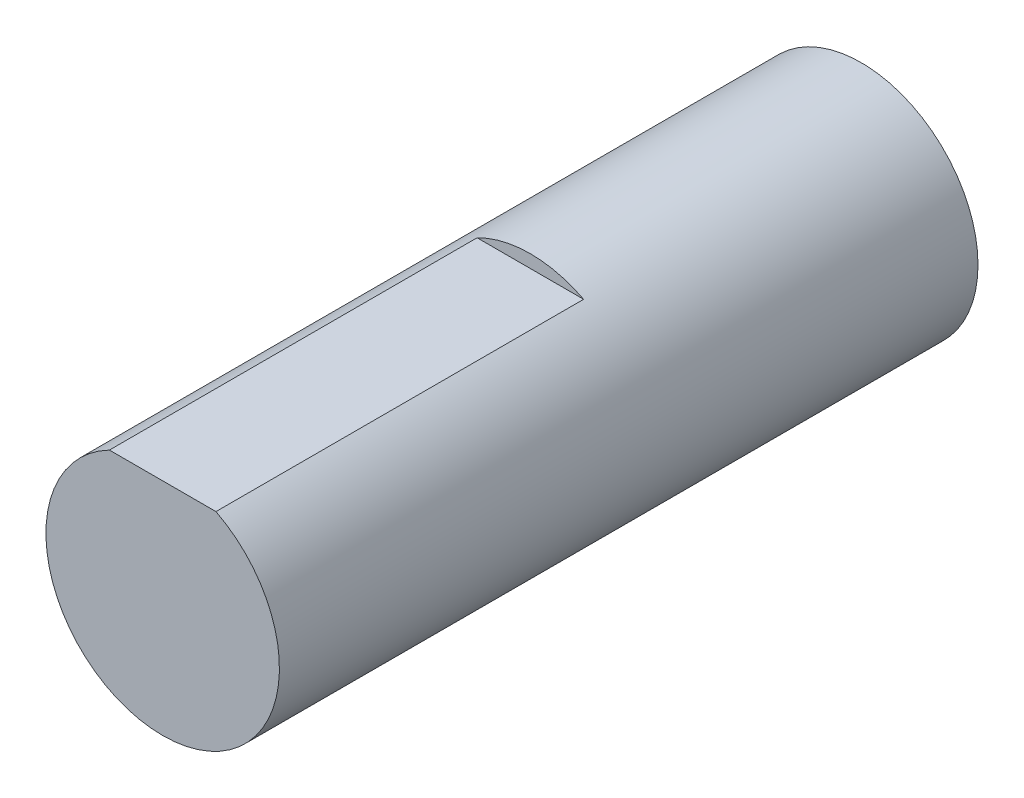
ISO-10303-21;
HEADER;
FILE_DESCRIPTION(('STEP AP214'),'2;1');
FILE_NAME('part.step','',(''),(''),'','','');
FILE_SCHEMA(('AUTOMOTIVE_DESIGN { 1 0 10303 214 1 1 1 1 }'));
ENDSEC;
DATA;
#1=APPLICATION_CONTEXT('core data for automotive mechanical design processes');
#2=APPLICATION_PROTOCOL_DEFINITION('international standard','automotive_design',2000,#1);
#3=PRODUCT_CONTEXT('',#1,'mechanical');
#4=PRODUCT('Part','Part','',(#3));
#5=PRODUCT_RELATED_PRODUCT_CATEGORY('part','',(#4));
#6=PRODUCT_DEFINITION_FORMATION('','',#4);
#7=PRODUCT_DEFINITION_CONTEXT('part definition',#1,'design');
#8=PRODUCT_DEFINITION('design','',#6,#7);
#9=PRODUCT_DEFINITION_SHAPE('','',#8);
#10=(LENGTH_UNIT() NAMED_UNIT(*) SI_UNIT(.MILLI.,.METRE.));
#11=(NAMED_UNIT(*) PLANE_ANGLE_UNIT() SI_UNIT($,.RADIAN.));
#12=(NAMED_UNIT(*) SI_UNIT($,.STERADIAN.) SOLID_ANGLE_UNIT());
#13=UNCERTAINTY_MEASURE_WITH_UNIT(LENGTH_MEASURE(1.E-05),#10,'distance_accuracy_value','');
#14=(GEOMETRIC_REPRESENTATION_CONTEXT(3) GLOBAL_UNCERTAINTY_ASSIGNED_CONTEXT((#13)) GLOBAL_UNIT_ASSIGNED_CONTEXT((#10,
#11,#12)) REPRESENTATION_CONTEXT('',''));
#15=CARTESIAN_POINT('',(0.,0.,0.));
#16=DIRECTION('',(0.,0.,1.));
#17=DIRECTION('',(1.,0.,0.));
#18=AXIS2_PLACEMENT_3D('',#15,#16,#17);
#19=CARTESIAN_POINT('',(0.,0.,19.));
#20=DIRECTION('',(0.,0.,-1.));
#21=DIRECTION('',(-1.,0.,0.));
#22=AXIS2_PLACEMENT_3D('',#19,#20,#21);
#23=CYLINDRICAL_SURFACE('',#22,3.175);
#24=CARTESIAN_POINT('',(0.,0.,9.));
#25=DIRECTION('',(0.,0.,-1.));
#26=DIRECTION('',(-1.,0.,0.));
#27=AXIS2_PLACEMENT_3D('',#24,#25,#26);
#28=CIRCLE('',#27,3.175);
#29=CARTESIAN_POINT('',(-1.44913767461894,2.825,9.));
#30=VERTEX_POINT('',#29);
#31=CARTESIAN_POINT('',(1.44913767461894,2.825,9.));
#32=VERTEX_POINT('',#31);
#33=EDGE_CURVE('E11',#30,#32,#28,.T.);
#34=ORIENTED_EDGE('',*,*,#33,.T.);
#35=DIRECTION('',(0.,0.,1.));
#36=VECTOR('',#35,1.);
#37=CARTESIAN_POINT('',(1.44913767461894,2.825,9.));
#38=LINE('',#37,#36);
#39=CARTESIAN_POINT('',(1.44913767461894,2.825,19.));
#40=VERTEX_POINT('',#39);
#41=EDGE_CURVE('E52',#32,#40,#38,.T.);
#42=ORIENTED_EDGE('',*,*,#41,.T.);
#43=CARTESIAN_POINT('',(0.,0.,19.));
#44=DIRECTION('',(0.,0.,1.));
#45=DIRECTION('',(1.,0.,0.));
#46=AXIS2_PLACEMENT_3D('',#43,#44,#45);
#47=CIRCLE('',#46,3.175);
#48=CARTESIAN_POINT('',(-1.44913767461894,2.825,19.));
#49=VERTEX_POINT('',#48);
#50=EDGE_CURVE('E39',#49,#40,#47,.T.);
#51=ORIENTED_EDGE('',*,*,#50,.F.);
#52=DIRECTION('',(0.,0.,1.));
#53=VECTOR('',#52,1.);
#54=CARTESIAN_POINT('',(-1.44913767461894,2.825,9.));
#55=LINE('',#54,#53);
#56=EDGE_CURVE('E46',#30,#49,#55,.T.);
#57=ORIENTED_EDGE('',*,*,#56,.F.);
#58=EDGE_LOOP('',(#34,#42,#51,#57));
#59=FACE_BOUND('',#58,.T.);
#60=CARTESIAN_POINT('',(0.,0.,0.));
#61=DIRECTION('',(0.,0.,1.));
#62=DIRECTION('',(1.,0.,0.));
#63=AXIS2_PLACEMENT_3D('',#60,#61,#62);
#64=CIRCLE('',#63,3.175);
#65=CARTESIAN_POINT('',(3.175,0.,0.));
#66=VERTEX_POINT('',#65);
#67=EDGE_CURVE('E66',#66,#66,#64,.T.);
#68=ORIENTED_EDGE('',*,*,#67,.T.);
#69=EDGE_LOOP('',(#68));
#70=FACE_BOUND('',#69,.T.);
#71=ADVANCED_FACE('F32',(#59,#70),#23,.T.);
#72=CARTESIAN_POINT('',(0.,0.,19.));
#73=DIRECTION('',(0.,0.,1.));
#74=DIRECTION('',(1.,0.,0.));
#75=AXIS2_PLACEMENT_3D('',#72,#73,#74);
#76=PLANE('',#75);
#77=DIRECTION('',(1.,0.,0.));
#78=VECTOR('',#77,1.);
#79=CARTESIAN_POINT('',(-1.44913767461894,2.825,19.));
#80=LINE('',#79,#78);
#81=EDGE_CURVE('E57',#49,#40,#80,.T.);
#82=ORIENTED_EDGE('',*,*,#81,.F.);
#83=ORIENTED_EDGE('',*,*,#50,.T.);
#84=EDGE_LOOP('',(#82,#83));
#85=FACE_BOUND('',#84,.T.);
#86=ADVANCED_FACE('F68',(#85),#76,.T.);
#87=CARTESIAN_POINT('',(0.,0.,0.));
#88=DIRECTION('',(0.,0.,1.));
#89=DIRECTION('',(1.,0.,0.));
#90=AXIS2_PLACEMENT_3D('',#87,#88,#89);
#91=PLANE('',#90);
#92=ORIENTED_EDGE('',*,*,#67,.F.);
#93=EDGE_LOOP('',(#92));
#94=FACE_BOUND('',#93,.T.);
#95=ADVANCED_FACE('F76',(#94),#91,.F.);
#96=CARTESIAN_POINT('',(0.,0.,9.));
#97=DIRECTION('',(0.,0.,-1.));
#98=DIRECTION('',(-1.,0.,0.));
#99=AXIS2_PLACEMENT_3D('',#96,#97,#98);
#100=PLANE('',#99);
#101=DIRECTION('',(1.,0.,0.));
#102=VECTOR('',#101,1.);
#103=CARTESIAN_POINT('',(-1.44913767461894,2.825,9.));
#104=LINE('',#103,#102);
#105=EDGE_CURVE('E62',#30,#32,#104,.T.);
#106=ORIENTED_EDGE('',*,*,#105,.T.);
#107=ORIENTED_EDGE('',*,*,#33,.F.);
#108=EDGE_LOOP('',(#106,#107));
#109=FACE_BOUND('',#108,.T.);
#110=ADVANCED_FACE('F74',(#109),#100,.F.);
#111=CARTESIAN_POINT('',(-1.44913767461894,2.825,9.));
#112=DIRECTION('',(0.,-1.,0.));
#113=DIRECTION('',(0.,0.,-1.));
#114=AXIS2_PLACEMENT_3D('',#111,#112,#113);
#115=PLANE('',#114);
#116=ORIENTED_EDGE('',*,*,#81,.T.);
#117=ORIENTED_EDGE('',*,*,#41,.F.);
#118=ORIENTED_EDGE('',*,*,#105,.F.);
#119=ORIENTED_EDGE('',*,*,#56,.T.);
#120=EDGE_LOOP('',(#116,#117,#118,#119));
#121=FACE_BOUND('',#120,.T.);
#122=ADVANCED_FACE('F58',(#121),#115,.F.);
#123=CLOSED_SHELL('',(#71,#86,#95,#110,#122));
#124=MANIFOLD_SOLID_BREP('B2',#123);
#125=ADVANCED_BREP_SHAPE_REPRESENTATION('',(#18,#124),#14);
#126=SHAPE_DEFINITION_REPRESENTATION(#9,#125);
ENDSEC;
END-ISO-10303-21;
